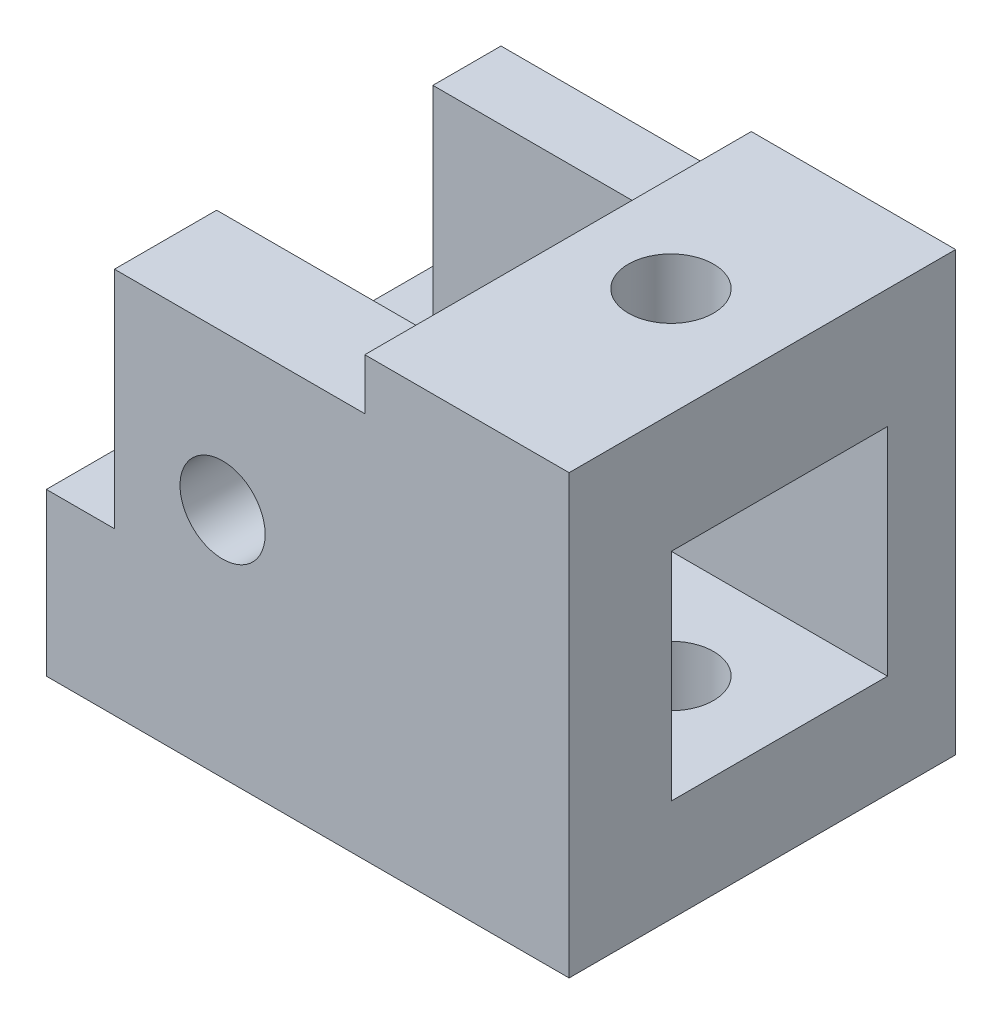
ISO-10303-21;
HEADER;
FILE_DESCRIPTION(('STEP AP214'),'2;1');
FILE_NAME('part.step','',(''),(''),'','','');
FILE_SCHEMA(('AUTOMOTIVE_DESIGN { 1 0 10303 214 1 1 1 1 }'));
ENDSEC;
DATA;
#1=APPLICATION_CONTEXT('core data for automotive mechanical design processes');
#2=APPLICATION_PROTOCOL_DEFINITION('international standard','automotive_design',2000,#1);
#3=PRODUCT_CONTEXT('',#1,'mechanical');
#4=PRODUCT('Part','Part','',(#3));
#5=PRODUCT_RELATED_PRODUCT_CATEGORY('part','',(#4));
#6=PRODUCT_DEFINITION_FORMATION('','',#4);
#7=PRODUCT_DEFINITION_CONTEXT('part definition',#1,'design');
#8=PRODUCT_DEFINITION('design','',#6,#7);
#9=PRODUCT_DEFINITION_SHAPE('','',#8);
#10=(LENGTH_UNIT() NAMED_UNIT(*) SI_UNIT(.MILLI.,.METRE.));
#11=(NAMED_UNIT(*) PLANE_ANGLE_UNIT() SI_UNIT($,.RADIAN.));
#12=(NAMED_UNIT(*) SI_UNIT($,.STERADIAN.) SOLID_ANGLE_UNIT());
#13=UNCERTAINTY_MEASURE_WITH_UNIT(LENGTH_MEASURE(1.E-05),#10,'distance_accuracy_value','');
#14=(GEOMETRIC_REPRESENTATION_CONTEXT(3) GLOBAL_UNCERTAINTY_ASSIGNED_CONTEXT((#13)) GLOBAL_UNIT_ASSIGNED_CONTEXT((#10,
#11,#12)) REPRESENTATION_CONTEXT('',''));
#15=CARTESIAN_POINT('',(0.,0.,0.));
#16=DIRECTION('',(0.,0.,1.));
#17=DIRECTION('',(1.,0.,0.));
#18=AXIS2_PLACEMENT_3D('',#15,#16,#17);
#19=CARTESIAN_POINT('',(0.,-6.,0.));
#20=DIRECTION('',(1.,0.,0.));
#21=DIRECTION('',(0.,0.,-1.));
#22=AXIS2_PLACEMENT_3D('',#19,#20,#21);
#23=PLANE('',#22);
#24=DIRECTION('',(0.,0.,-1.));
#25=VECTOR('',#24,1.);
#26=CARTESIAN_POINT('',(0.,3.5,0.));
#27=LINE('',#26,#25);
#28=CARTESIAN_POINT('',(0.,3.5,0.));
#29=VERTEX_POINT('',#28);
#30=CARTESIAN_POINT('',(0.,3.5,-6.));
#31=VERTEX_POINT('',#30);
#32=EDGE_CURVE('E77',#29,#31,#27,.T.);
#33=ORIENTED_EDGE('',*,*,#32,.F.);
#34=DIRECTION('',(0.,1.,0.));
#35=VECTOR('',#34,1.);
#36=CARTESIAN_POINT('',(0.,-6.,0.));
#37=LINE('',#36,#35);
#38=CARTESIAN_POINT('',(0.,16.7,0.));
#39=VERTEX_POINT('',#38);
#40=EDGE_CURVE('E346',#29,#39,#37,.T.);
#41=ORIENTED_EDGE('',*,*,#40,.T.);
#42=DIRECTION('',(0.,0.,1.));
#43=VECTOR('',#42,1.);
#44=CARTESIAN_POINT('',(0.,16.7,-6.));
#45=LINE('',#44,#43);
#46=CARTESIAN_POINT('',(0.,16.7,-6.));
#47=VERTEX_POINT('',#46);
#48=EDGE_CURVE('E275',#47,#39,#45,.T.);
#49=ORIENTED_EDGE('',*,*,#48,.F.);
#50=DIRECTION('',(0.,-1.,0.));
#51=VECTOR('',#50,1.);
#52=CARTESIAN_POINT('',(0.,12.7,-6.));
#53=LINE('',#52,#51);
#54=EDGE_CURVE('E335',#47,#31,#53,.T.);
#55=ORIENTED_EDGE('',*,*,#54,.T.);
#56=EDGE_LOOP('',(#33,#41,#49,#55));
#57=FACE_BOUND('',#56,.T.);
#58=ADVANCED_FACE('F65',(#57),#23,.F.);
#59=CARTESIAN_POINT('',(0.,3.5,-18.7));
#60=VERTEX_POINT('',#59);
#61=CARTESIAN_POINT('',(0.,3.5,-22.7));
#62=VERTEX_POINT('',#61);
#63=EDGE_CURVE('E12',#60,#62,#27,.T.);
#64=ORIENTED_EDGE('',*,*,#63,.F.);
#65=DIRECTION('',(0.,-1.,0.));
#66=VECTOR('',#65,1.);
#67=CARTESIAN_POINT('',(0.,12.7,-18.7));
#68=LINE('',#67,#66);
#69=CARTESIAN_POINT('',(0.,16.7,-18.7));
#70=VERTEX_POINT('',#69);
#71=EDGE_CURVE('E321',#70,#60,#68,.T.);
#72=ORIENTED_EDGE('',*,*,#71,.F.);
#73=DIRECTION('',(0.,0.,1.));
#74=VECTOR('',#73,1.);
#75=CARTESIAN_POINT('',(0.,16.7,-22.7));
#76=LINE('',#75,#74);
#77=CARTESIAN_POINT('',(0.,16.7,-22.7));
#78=VERTEX_POINT('',#77);
#79=EDGE_CURVE('E260',#78,#70,#76,.T.);
#80=ORIENTED_EDGE('',*,*,#79,.F.);
#81=DIRECTION('',(0.,1.,0.));
#82=VECTOR('',#81,1.);
#83=CARTESIAN_POINT('',(0.,-6.,-22.7));
#84=LINE('',#83,#82);
#85=EDGE_CURVE('E185',#62,#78,#84,.T.);
#86=ORIENTED_EDGE('',*,*,#85,.F.);
#87=EDGE_LOOP('',(#64,#72,#80,#86));
#88=FACE_BOUND('',#87,.T.);
#89=ADVANCED_FACE('F364',(#88),#23,.F.);
#90=CARTESIAN_POINT('',(0.,0.,0.));
#91=DIRECTION('',(0.,1.,0.));
#92=DIRECTION('',(0.,0.,1.));
#93=AXIS2_PLACEMENT_3D('',#90,#91,#92);
#94=PLANE('',#93);
#95=CARTESIAN_POINT('',(20.33,0.,-12.35));
#96=DIRECTION('',(0.,1.,0.));
#97=DIRECTION('',(0.,0.,1.));
#98=AXIS2_PLACEMENT_3D('',#95,#96,#97);
#99=CIRCLE('',#98,2.5);
#100=CARTESIAN_POINT('',(20.33,0.,-9.85));
#101=VERTEX_POINT('',#100);
#102=EDGE_CURVE('E252',#101,#101,#99,.T.);
#103=ORIENTED_EDGE('',*,*,#102,.F.);
#104=EDGE_LOOP('',(#103));
#105=FACE_BOUND('',#104,.T.);
#106=DIRECTION('',(0.,0.,-1.));
#107=VECTOR('',#106,1.);
#108=CARTESIAN_POINT('',(26.7,0.,0.));
#109=LINE('',#108,#107);
#110=CARTESIAN_POINT('',(26.7,0.,-6.));
#111=VERTEX_POINT('',#110);
#112=CARTESIAN_POINT('',(26.7,0.,-18.7));
#113=VERTEX_POINT('',#112);
#114=EDGE_CURVE('E343',#111,#113,#109,.T.);
#115=ORIENTED_EDGE('',*,*,#114,.T.);
#116=DIRECTION('',(1.,0.,0.));
#117=VECTOR('',#116,1.);
#118=CARTESIAN_POINT('',(0.,0.,-18.7));
#119=LINE('',#118,#117);
#120=CARTESIAN_POINT('',(0.,0.,-18.7));
#121=VERTEX_POINT('',#120);
#122=EDGE_CURVE('E312',#121,#113,#119,.T.);
#123=ORIENTED_EDGE('',*,*,#122,.F.);
#124=DIRECTION('',(0.,0.,-1.));
#125=VECTOR('',#124,1.);
#126=CARTESIAN_POINT('',(0.,0.,0.));
#127=LINE('',#126,#125);
#128=CARTESIAN_POINT('',(0.,0.,-6.));
#129=VERTEX_POINT('',#128);
#130=EDGE_CURVE('E347',#129,#121,#127,.T.);
#131=ORIENTED_EDGE('',*,*,#130,.F.);
#132=DIRECTION('',(1.,0.,0.));
#133=VECTOR('',#132,1.);
#134=CARTESIAN_POINT('',(0.,0.,-6.));
#135=LINE('',#134,#133);
#136=EDGE_CURVE('E327',#129,#111,#135,.T.);
#137=ORIENTED_EDGE('',*,*,#136,.T.);
#138=EDGE_LOOP('',(#115,#123,#131,#137));
#139=FACE_BOUND('',#138,.T.);
#140=ADVANCED_FACE('F413',(#105,#139),#94,.T.);
#141=CARTESIAN_POINT('',(0.,-6.,0.));
#142=DIRECTION('',(0.,0.,1.));
#143=DIRECTION('',(1.,0.,0.));
#144=AXIS2_PLACEMENT_3D('',#141,#142,#143);
#145=PLANE('',#144);
#146=CARTESIAN_POINT('',(6.35,7.63,0.));
#147=DIRECTION('',(0.,0.,1.));
#148=DIRECTION('',(1.,0.,0.));
#149=AXIS2_PLACEMENT_3D('',#146,#147,#148);
#150=CIRCLE('',#149,2.5);
#151=CARTESIAN_POINT('',(8.85,7.63,0.));
#152=VERTEX_POINT('',#151);
#153=EDGE_CURVE('E300',#152,#152,#150,.T.);
#154=ORIENTED_EDGE('',*,*,#153,.F.);
#155=EDGE_LOOP('',(#154));
#156=FACE_BOUND('',#155,.T.);
#157=DIRECTION('',(0.,1.,0.));
#158=VECTOR('',#157,1.);
#159=CARTESIAN_POINT('',(26.7,-6.,0.));
#160=LINE('',#159,#158);
#161=CARTESIAN_POINT('',(26.7,-6.,0.));
#162=VERTEX_POINT('',#161);
#163=CARTESIAN_POINT('',(26.7,19.7,0.));
#164=VERTEX_POINT('',#163);
#165=EDGE_CURVE('E75',#162,#164,#160,.T.);
#166=ORIENTED_EDGE('',*,*,#165,.T.);
#167=DIRECTION('',(1.,0.,0.));
#168=VECTOR('',#167,1.);
#169=CARTESIAN_POINT('',(26.7,19.7,0.));
#170=LINE('',#169,#168);
#171=CARTESIAN_POINT('',(14.7,19.7,0.));
#172=VERTEX_POINT('',#171);
#173=EDGE_CURVE('E201',#172,#164,#170,.T.);
#174=ORIENTED_EDGE('',*,*,#173,.F.);
#175=DIRECTION('',(0.,-1.,0.));
#176=VECTOR('',#175,1.);
#177=CARTESIAN_POINT('',(14.7,19.7,0.));
#178=LINE('',#177,#176);
#179=CARTESIAN_POINT('',(14.7,16.7,0.));
#180=VERTEX_POINT('',#179);
#181=EDGE_CURVE('E212',#172,#180,#178,.T.);
#182=ORIENTED_EDGE('',*,*,#181,.T.);
#183=DIRECTION('',(1.,0.,0.));
#184=VECTOR('',#183,1.);
#185=CARTESIAN_POINT('',(0.,16.7,0.));
#186=LINE('',#185,#184);
#187=EDGE_CURVE('E279',#39,#180,#186,.T.);
#188=ORIENTED_EDGE('',*,*,#187,.F.);
#189=ORIENTED_EDGE('',*,*,#40,.F.);
#190=DIRECTION('',(1.,0.,0.));
#191=VECTOR('',#190,1.);
#192=CARTESIAN_POINT('',(-4.,3.5,0.));
#193=LINE('',#192,#191);
#194=CARTESIAN_POINT('',(-4.,3.5,0.));
#195=VERTEX_POINT('',#194);
#196=EDGE_CURVE('E240',#195,#29,#193,.T.);
#197=ORIENTED_EDGE('',*,*,#196,.F.);
#198=DIRECTION('',(0.,1.,0.));
#199=VECTOR('',#198,1.);
#200=CARTESIAN_POINT('',(-4.,-6.,0.));
#201=LINE('',#200,#199);
#202=CARTESIAN_POINT('',(-4.,-6.,0.));
#203=VERTEX_POINT('',#202);
#204=EDGE_CURVE('E219',#203,#195,#201,.T.);
#205=ORIENTED_EDGE('',*,*,#204,.F.);
#206=DIRECTION('',(1.,0.,0.));
#207=VECTOR('',#206,1.);
#208=CARTESIAN_POINT('',(0.,-6.,0.));
#209=LINE('',#208,#207);
#210=EDGE_CURVE('E339',#203,#162,#209,.T.);
#211=ORIENTED_EDGE('',*,*,#210,.T.);
#212=EDGE_LOOP('',(#166,#174,#182,#188,#189,#197,#205,#211));
#213=FACE_BOUND('',#212,.T.);
#214=ADVANCED_FACE('F385',(#156,#213),#145,.T.);
#215=CARTESIAN_POINT('',(26.7,-6.,0.));
#216=DIRECTION('',(1.,0.,0.));
#217=DIRECTION('',(0.,0.,-1.));
#218=AXIS2_PLACEMENT_3D('',#215,#216,#217);
#219=PLANE('',#218);
#220=DIRECTION('',(0.,-1.,0.));
#221=VECTOR('',#220,1.);
#222=CARTESIAN_POINT('',(26.7,12.7,-6.));
#223=LINE('',#222,#221);
#224=CARTESIAN_POINT('',(26.7,12.7,-6.));
#225=VERTEX_POINT('',#224);
#226=EDGE_CURVE('E331',#225,#111,#223,.T.);
#227=ORIENTED_EDGE('',*,*,#226,.F.);
#228=DIRECTION('',(0.,0.,-1.));
#229=VECTOR('',#228,1.);
#230=CARTESIAN_POINT('',(26.7,12.7,0.));
#231=LINE('',#230,#229);
#232=CARTESIAN_POINT('',(26.7,12.7,-18.7));
#233=VERTEX_POINT('',#232);
#234=EDGE_CURVE('E261',#225,#233,#231,.T.);
#235=ORIENTED_EDGE('',*,*,#234,.T.);
#236=DIRECTION('',(0.,-1.,0.));
#237=VECTOR('',#236,1.);
#238=CARTESIAN_POINT('',(26.7,12.7,-18.7));
#239=LINE('',#238,#237);
#240=EDGE_CURVE('E324',#233,#113,#239,.T.);
#241=ORIENTED_EDGE('',*,*,#240,.T.);
#242=ORIENTED_EDGE('',*,*,#114,.F.);
#243=EDGE_LOOP('',(#227,#235,#241,#242));
#244=FACE_BOUND('',#243,.T.);
#245=DIRECTION('',(0.,1.,0.));
#246=VECTOR('',#245,1.);
#247=CARTESIAN_POINT('',(26.7,-6.,-22.7));
#248=LINE('',#247,#246);
#249=CARTESIAN_POINT('',(26.7,-6.,-22.7));
#250=VERTEX_POINT('',#249);
#251=CARTESIAN_POINT('',(26.7,19.7,-22.7));
#252=VERTEX_POINT('',#251);
#253=EDGE_CURVE('E175',#250,#252,#248,.T.);
#254=ORIENTED_EDGE('',*,*,#253,.T.);
#255=DIRECTION('',(0.,0.,-1.));
#256=VECTOR('',#255,1.);
#257=CARTESIAN_POINT('',(26.7,19.7,-22.7));
#258=LINE('',#257,#256);
#259=EDGE_CURVE('E179',#164,#252,#258,.T.);
#260=ORIENTED_EDGE('',*,*,#259,.F.);
#261=ORIENTED_EDGE('',*,*,#165,.F.);
#262=DIRECTION('',(0.,0.,-1.));
#263=VECTOR('',#262,1.);
#264=CARTESIAN_POINT('',(26.7,-6.,0.));
#265=LINE('',#264,#263);
#266=EDGE_CURVE('E181',#162,#250,#265,.T.);
#267=ORIENTED_EDGE('',*,*,#266,.T.);
#268=EDGE_LOOP('',(#254,#260,#261,#267));
#269=FACE_BOUND('',#268,.T.);
#270=ADVANCED_FACE('F177',(#244,#269),#219,.T.);
#271=CARTESIAN_POINT('',(0.,-6.,0.));
#272=DIRECTION('',(0.,1.,0.));
#273=DIRECTION('',(0.,0.,1.));
#274=AXIS2_PLACEMENT_3D('',#271,#272,#273);
#275=PLANE('',#274);
#276=CARTESIAN_POINT('',(20.33,-6.,-12.35));
#277=DIRECTION('',(0.,1.,0.));
#278=DIRECTION('',(0.,0.,1.));
#279=AXIS2_PLACEMENT_3D('',#276,#277,#278);
#280=CIRCLE('',#279,2.5);
#281=CARTESIAN_POINT('',(20.33,-6.,-9.85));
#282=VERTEX_POINT('',#281);
#283=EDGE_CURVE('E244',#282,#282,#280,.T.);
#284=ORIENTED_EDGE('',*,*,#283,.T.);
#285=EDGE_LOOP('',(#284));
#286=FACE_BOUND('',#285,.T.);
#287=ORIENTED_EDGE('',*,*,#210,.F.);
#288=DIRECTION('',(0.,0.,1.));
#289=VECTOR('',#288,1.);
#290=CARTESIAN_POINT('',(-4.,-6.,0.));
#291=LINE('',#290,#289);
#292=CARTESIAN_POINT('',(-4.,-6.,-22.7));
#293=VERTEX_POINT('',#292);
#294=EDGE_CURVE('E230',#293,#203,#291,.T.);
#295=ORIENTED_EDGE('',*,*,#294,.F.);
#296=DIRECTION('',(1.,0.,0.));
#297=VECTOR('',#296,1.);
#298=CARTESIAN_POINT('',(0.,-6.,-22.7));
#299=LINE('',#298,#297);
#300=EDGE_CURVE('E186',#293,#250,#299,.T.);
#301=ORIENTED_EDGE('',*,*,#300,.T.);
#302=ORIENTED_EDGE('',*,*,#266,.F.);
#303=EDGE_LOOP('',(#287,#295,#301,#302));
#304=FACE_BOUND('',#303,.T.);
#305=ADVANCED_FACE('F394',(#286,#304),#275,.F.);
#306=CARTESIAN_POINT('',(0.,-6.,-22.7));
#307=DIRECTION('',(0.,0.,1.));
#308=DIRECTION('',(1.,0.,0.));
#309=AXIS2_PLACEMENT_3D('',#306,#307,#308);
#310=PLANE('',#309);
#311=CARTESIAN_POINT('',(6.35,7.63,-22.7));
#312=DIRECTION('',(0.,0.,1.));
#313=DIRECTION('',(1.,0.,0.));
#314=AXIS2_PLACEMENT_3D('',#311,#312,#313);
#315=CIRCLE('',#314,2.5);
#316=CARTESIAN_POINT('',(8.85,7.63,-22.7));
#317=VERTEX_POINT('',#316);
#318=EDGE_CURVE('E301',#317,#317,#315,.T.);
#319=ORIENTED_EDGE('',*,*,#318,.T.);
#320=EDGE_LOOP('',(#319));
#321=FACE_BOUND('',#320,.T.);
#322=ORIENTED_EDGE('',*,*,#300,.F.);
#323=DIRECTION('',(0.,-1.,0.));
#324=VECTOR('',#323,1.);
#325=CARTESIAN_POINT('',(-4.,-6.,-22.7));
#326=LINE('',#325,#324);
#327=CARTESIAN_POINT('',(-4.,3.5,-22.7));
#328=VERTEX_POINT('',#327);
#329=EDGE_CURVE('E226',#328,#293,#326,.T.);
#330=ORIENTED_EDGE('',*,*,#329,.F.);
#331=DIRECTION('',(1.,0.,0.));
#332=VECTOR('',#331,1.);
#333=CARTESIAN_POINT('',(-4.,3.5,-22.7));
#334=LINE('',#333,#332);
#335=EDGE_CURVE('E233',#328,#62,#334,.T.);
#336=ORIENTED_EDGE('',*,*,#335,.T.);
#337=ORIENTED_EDGE('',*,*,#85,.T.);
#338=DIRECTION('',(-1.,0.,0.));
#339=VECTOR('',#338,1.);
#340=CARTESIAN_POINT('',(26.7,16.7,-22.7));
#341=LINE('',#340,#339);
#342=CARTESIAN_POINT('',(14.7,16.7,-22.7));
#343=VERTEX_POINT('',#342);
#344=EDGE_CURVE('E257',#343,#78,#341,.T.);
#345=ORIENTED_EDGE('',*,*,#344,.F.);
#346=DIRECTION('',(0.,-1.,0.));
#347=VECTOR('',#346,1.);
#348=CARTESIAN_POINT('',(14.7,19.7,-22.7));
#349=LINE('',#348,#347);
#350=CARTESIAN_POINT('',(14.7,19.7,-22.7));
#351=VERTEX_POINT('',#350);
#352=EDGE_CURVE('E191',#351,#343,#349,.T.);
#353=ORIENTED_EDGE('',*,*,#352,.F.);
#354=DIRECTION('',(-1.,0.,0.));
#355=VECTOR('',#354,1.);
#356=CARTESIAN_POINT('',(26.7,19.7,-22.7));
#357=LINE('',#356,#355);
#358=EDGE_CURVE('E189',#252,#351,#357,.T.);
#359=ORIENTED_EDGE('',*,*,#358,.F.);
#360=ORIENTED_EDGE('',*,*,#253,.F.);
#361=EDGE_LOOP('',(#322,#330,#336,#337,#345,#353,#359,#360));
#362=FACE_BOUND('',#361,.T.);
#363=ADVANCED_FACE('F67',(#321,#362),#310,.F.);
#364=CARTESIAN_POINT('',(0.,12.7,-6.));
#365=DIRECTION('',(0.,0.,-1.));
#366=DIRECTION('',(-1.,0.,0.));
#367=AXIS2_PLACEMENT_3D('',#364,#365,#366);
#368=PLANE('',#367);
#369=CARTESIAN_POINT('',(6.35,7.63,-6.));
#370=DIRECTION('',(0.,0.,-1.));
#371=DIRECTION('',(-1.,0.,0.));
#372=AXIS2_PLACEMENT_3D('',#369,#370,#371);
#373=CIRCLE('',#372,2.5);
#374=CARTESIAN_POINT('',(3.85,7.63,-6.));
#375=VERTEX_POINT('',#374);
#376=EDGE_CURVE('E308',#375,#375,#373,.T.);
#377=ORIENTED_EDGE('',*,*,#376,.F.);
#378=EDGE_LOOP('',(#377));
#379=FACE_BOUND('',#378,.T.);
#380=ORIENTED_EDGE('',*,*,#136,.F.);
#381=EDGE_CURVE('E334',#31,#129,#53,.T.);
#382=ORIENTED_EDGE('',*,*,#381,.F.);
#383=ORIENTED_EDGE('',*,*,#54,.F.);
#384=DIRECTION('',(-1.,0.,0.));
#385=VECTOR('',#384,1.);
#386=CARTESIAN_POINT('',(12.7,16.7,-6.));
#387=LINE('',#386,#385);
#388=CARTESIAN_POINT('',(12.7,16.7,-6.));
#389=VERTEX_POINT('',#388);
#390=EDGE_CURVE('E271',#389,#47,#387,.T.);
#391=ORIENTED_EDGE('',*,*,#390,.F.);
#392=DIRECTION('',(0.,-1.,0.));
#393=VECTOR('',#392,1.);
#394=CARTESIAN_POINT('',(12.7,16.7,-6.));
#395=LINE('',#394,#393);
#396=CARTESIAN_POINT('',(12.7,12.7,-6.));
#397=VERTEX_POINT('',#396);
#398=EDGE_CURVE('E282',#389,#397,#395,.T.);
#399=ORIENTED_EDGE('',*,*,#398,.T.);
#400=DIRECTION('',(1.,0.,0.));
#401=VECTOR('',#400,1.);
#402=CARTESIAN_POINT('',(0.,12.7,-6.));
#403=LINE('',#402,#401);
#404=EDGE_CURVE('E296',#397,#225,#403,.T.);
#405=ORIENTED_EDGE('',*,*,#404,.T.);
#406=ORIENTED_EDGE('',*,*,#226,.T.);
#407=EDGE_LOOP('',(#380,#382,#383,#391,#399,#405,#406));
#408=FACE_BOUND('',#407,.T.);
#409=ADVANCED_FACE('F402',(#379,#408),#368,.T.);
#410=CARTESIAN_POINT('',(0.,12.7,-18.7));
#411=DIRECTION('',(0.,0.,-1.));
#412=DIRECTION('',(-1.,0.,0.));
#413=AXIS2_PLACEMENT_3D('',#410,#411,#412);
#414=PLANE('',#413);
#415=CARTESIAN_POINT('',(6.35,7.63,-18.7));
#416=DIRECTION('',(0.,0.,-1.));
#417=DIRECTION('',(-1.,0.,0.));
#418=AXIS2_PLACEMENT_3D('',#415,#416,#417);
#419=CIRCLE('',#418,2.5);
#420=CARTESIAN_POINT('',(3.85,7.63,-18.7));
#421=VERTEX_POINT('',#420);
#422=EDGE_CURVE('E69',#421,#421,#419,.T.);
#423=ORIENTED_EDGE('',*,*,#422,.T.);
#424=EDGE_LOOP('',(#423));
#425=FACE_BOUND('',#424,.T.);
#426=ORIENTED_EDGE('',*,*,#122,.T.);
#427=ORIENTED_EDGE('',*,*,#240,.F.);
#428=DIRECTION('',(1.,0.,0.));
#429=VECTOR('',#428,1.);
#430=CARTESIAN_POINT('',(0.,12.7,-18.7));
#431=LINE('',#430,#429);
#432=CARTESIAN_POINT('',(12.7,12.7,-18.7));
#433=VERTEX_POINT('',#432);
#434=EDGE_CURVE('E313',#433,#233,#431,.T.);
#435=ORIENTED_EDGE('',*,*,#434,.F.);
#436=DIRECTION('',(0.,-1.,0.));
#437=VECTOR('',#436,1.);
#438=CARTESIAN_POINT('',(12.7,16.7,-18.7));
#439=LINE('',#438,#437);
#440=CARTESIAN_POINT('',(12.7,16.7,-18.7));
#441=VERTEX_POINT('',#440);
#442=EDGE_CURVE('E292',#441,#433,#439,.T.);
#443=ORIENTED_EDGE('',*,*,#442,.F.);
#444=DIRECTION('',(1.,0.,0.));
#445=VECTOR('',#444,1.);
#446=CARTESIAN_POINT('',(0.,16.7,-18.7));
#447=LINE('',#446,#445);
#448=EDGE_CURVE('E265',#70,#441,#447,.T.);
#449=ORIENTED_EDGE('',*,*,#448,.F.);
#450=ORIENTED_EDGE('',*,*,#71,.T.);
#451=EDGE_CURVE('E317',#60,#121,#68,.T.);
#452=ORIENTED_EDGE('',*,*,#451,.T.);
#453=EDGE_LOOP('',(#426,#427,#435,#443,#449,#450,#452));
#454=FACE_BOUND('',#453,.T.);
#455=ADVANCED_FACE('F369',(#425,#454),#414,.F.);
#456=CARTESIAN_POINT('',(6.35,7.63,-22.7));
#457=DIRECTION('',(0.,0.,1.));
#458=DIRECTION('',(1.,0.,0.));
#459=AXIS2_PLACEMENT_3D('',#456,#457,#458);
#460=CYLINDRICAL_SURFACE('',#459,2.5);
#461=ORIENTED_EDGE('',*,*,#318,.F.);
#462=EDGE_LOOP('',(#461));
#463=FACE_BOUND('',#462,.T.);
#464=ORIENTED_EDGE('',*,*,#422,.F.);
#465=EDGE_LOOP('',(#464));
#466=FACE_BOUND('',#465,.T.);
#467=ADVANCED_FACE('F446',(#463,#466),#460,.F.);
#468=ORIENTED_EDGE('',*,*,#376,.T.);
#469=EDGE_LOOP('',(#468));
#470=FACE_BOUND('',#469,.T.);
#471=ORIENTED_EDGE('',*,*,#153,.T.);
#472=EDGE_LOOP('',(#471));
#473=FACE_BOUND('',#472,.T.);
#474=ADVANCED_FACE('F438',(#470,#473),#460,.F.);
#475=CARTESIAN_POINT('',(0.,12.7,0.));
#476=DIRECTION('',(0.,1.,0.));
#477=DIRECTION('',(0.,0.,1.));
#478=AXIS2_PLACEMENT_3D('',#475,#476,#477);
#479=PLANE('',#478);
#480=CARTESIAN_POINT('',(20.33,12.7,-12.35));
#481=DIRECTION('',(0.,1.,0.));
#482=DIRECTION('',(0.,0.,1.));
#483=AXIS2_PLACEMENT_3D('',#480,#481,#482);
#484=CIRCLE('',#483,2.5);
#485=CARTESIAN_POINT('',(20.33,12.7,-9.85));
#486=VERTEX_POINT('',#485);
#487=EDGE_CURVE('E248',#486,#486,#484,.T.);
#488=ORIENTED_EDGE('',*,*,#487,.T.);
#489=EDGE_LOOP('',(#488));
#490=FACE_BOUND('',#489,.T.);
#491=ORIENTED_EDGE('',*,*,#404,.F.);
#492=DIRECTION('',(0.,0.,1.));
#493=VECTOR('',#492,1.);
#494=CARTESIAN_POINT('',(12.7,12.7,-18.7));
#495=LINE('',#494,#493);
#496=EDGE_CURVE('E256',#433,#397,#495,.T.);
#497=ORIENTED_EDGE('',*,*,#496,.F.);
#498=ORIENTED_EDGE('',*,*,#434,.T.);
#499=ORIENTED_EDGE('',*,*,#234,.F.);
#500=EDGE_LOOP('',(#491,#497,#498,#499));
#501=FACE_BOUND('',#500,.T.);
#502=ADVANCED_FACE('F436',(#490,#501),#479,.F.);
#503=CARTESIAN_POINT('',(12.7,16.7,-18.7));
#504=DIRECTION('',(1.,0.,0.));
#505=DIRECTION('',(0.,0.,-1.));
#506=AXIS2_PLACEMENT_3D('',#503,#504,#505);
#507=PLANE('',#506);
#508=ORIENTED_EDGE('',*,*,#496,.T.);
#509=ORIENTED_EDGE('',*,*,#398,.F.);
#510=DIRECTION('',(0.,0.,1.));
#511=VECTOR('',#510,1.);
#512=CARTESIAN_POINT('',(12.7,16.7,-18.7));
#513=LINE('',#512,#511);
#514=EDGE_CURVE('E268',#441,#389,#513,.T.);
#515=ORIENTED_EDGE('',*,*,#514,.F.);
#516=ORIENTED_EDGE('',*,*,#442,.T.);
#517=EDGE_LOOP('',(#508,#509,#515,#516));
#518=FACE_BOUND('',#517,.T.);
#519=ADVANCED_FACE('F375',(#518),#507,.F.);
#520=CARTESIAN_POINT('',(0.,16.7,0.));
#521=DIRECTION('',(0.,1.,0.));
#522=DIRECTION('',(0.,0.,1.));
#523=AXIS2_PLACEMENT_3D('',#520,#521,#522);
#524=PLANE('',#523);
#525=DIRECTION('',(0.,0.,1.));
#526=VECTOR('',#525,1.);
#527=CARTESIAN_POINT('',(14.7,16.7,-22.7));
#528=LINE('',#527,#526);
#529=EDGE_CURVE('E85',#343,#180,#528,.T.);
#530=ORIENTED_EDGE('',*,*,#529,.F.);
#531=ORIENTED_EDGE('',*,*,#344,.T.);
#532=ORIENTED_EDGE('',*,*,#79,.T.);
#533=ORIENTED_EDGE('',*,*,#448,.T.);
#534=ORIENTED_EDGE('',*,*,#514,.T.);
#535=ORIENTED_EDGE('',*,*,#390,.T.);
#536=ORIENTED_EDGE('',*,*,#48,.T.);
#537=ORIENTED_EDGE('',*,*,#187,.T.);
#538=EDGE_LOOP('',(#530,#531,#532,#533,#534,#535,#536,#537));
#539=FACE_BOUND('',#538,.T.);
#540=ADVANCED_FACE('F366',(#539),#524,.T.);
#541=CARTESIAN_POINT('',(20.33,-6.,-12.35));
#542=DIRECTION('',(0.,1.,0.));
#543=DIRECTION('',(0.,0.,1.));
#544=AXIS2_PLACEMENT_3D('',#541,#542,#543);
#545=CYLINDRICAL_SURFACE('',#544,2.5);
#546=ORIENTED_EDGE('',*,*,#487,.F.);
#547=EDGE_LOOP('',(#546));
#548=FACE_BOUND('',#547,.T.);
#549=CARTESIAN_POINT('',(20.33,19.7,-12.35));
#550=DIRECTION('',(0.,1.,0.));
#551=DIRECTION('',(0.,0.,1.));
#552=AXIS2_PLACEMENT_3D('',#549,#550,#551);
#553=CIRCLE('',#552,2.5);
#554=CARTESIAN_POINT('',(20.33,19.7,-9.85));
#555=VERTEX_POINT('',#554);
#556=EDGE_CURVE('E205',#555,#555,#553,.T.);
#557=ORIENTED_EDGE('',*,*,#556,.T.);
#558=EDGE_LOOP('',(#557));
#559=FACE_BOUND('',#558,.T.);
#560=ADVANCED_FACE('F524',(#548,#559),#545,.F.);
#561=ORIENTED_EDGE('',*,*,#102,.T.);
#562=EDGE_LOOP('',(#561));
#563=FACE_BOUND('',#562,.T.);
#564=ORIENTED_EDGE('',*,*,#283,.F.);
#565=EDGE_LOOP('',(#564));
#566=FACE_BOUND('',#565,.T.);
#567=ADVANCED_FACE('F475',(#563,#566),#545,.F.);
#568=CARTESIAN_POINT('',(0.,0.,0.));
#569=DIRECTION('',(-1.,0.,0.));
#570=DIRECTION('',(0.,0.,1.));
#571=AXIS2_PLACEMENT_3D('',#568,#569,#570);
#572=PLANE('',#571);
#573=EDGE_CURVE('E78',#31,#60,#27,.T.);
#574=ORIENTED_EDGE('',*,*,#573,.F.);
#575=ORIENTED_EDGE('',*,*,#381,.T.);
#576=ORIENTED_EDGE('',*,*,#130,.T.);
#577=ORIENTED_EDGE('',*,*,#451,.F.);
#578=EDGE_LOOP('',(#574,#575,#576,#577));
#579=FACE_BOUND('',#578,.T.);
#580=ADVANCED_FACE('F433',(#579),#572,.F.);
#581=CARTESIAN_POINT('',(-4.,3.5,0.));
#582=DIRECTION('',(0.,-1.,0.));
#583=DIRECTION('',(0.,0.,-1.));
#584=AXIS2_PLACEMENT_3D('',#581,#582,#583);
#585=PLANE('',#584);
#586=ORIENTED_EDGE('',*,*,#32,.T.);
#587=ORIENTED_EDGE('',*,*,#573,.T.);
#588=ORIENTED_EDGE('',*,*,#63,.T.);
#589=ORIENTED_EDGE('',*,*,#335,.F.);
#590=DIRECTION('',(0.,0.,-1.));
#591=VECTOR('',#590,1.);
#592=CARTESIAN_POINT('',(-4.,3.5,0.));
#593=LINE('',#592,#591);
#594=EDGE_CURVE('E223',#195,#328,#593,.T.);
#595=ORIENTED_EDGE('',*,*,#594,.F.);
#596=ORIENTED_EDGE('',*,*,#196,.T.);
#597=EDGE_LOOP('',(#586,#587,#588,#589,#595,#596));
#598=FACE_BOUND('',#597,.T.);
#599=ADVANCED_FACE('F388',(#598),#585,.F.);
#600=CARTESIAN_POINT('',(-4.,0.,0.));
#601=DIRECTION('',(-1.,0.,0.));
#602=DIRECTION('',(0.,0.,1.));
#603=AXIS2_PLACEMENT_3D('',#600,#601,#602);
#604=PLANE('',#603);
#605=ORIENTED_EDGE('',*,*,#204,.T.);
#606=ORIENTED_EDGE('',*,*,#594,.T.);
#607=ORIENTED_EDGE('',*,*,#329,.T.);
#608=ORIENTED_EDGE('',*,*,#294,.T.);
#609=EDGE_LOOP('',(#605,#606,#607,#608));
#610=FACE_BOUND('',#609,.T.);
#611=ADVANCED_FACE('F391',(#610),#604,.T.);
#612=CARTESIAN_POINT('',(0.,19.7,0.));
#613=DIRECTION('',(0.,-1.,0.));
#614=DIRECTION('',(0.,0.,-1.));
#615=AXIS2_PLACEMENT_3D('',#612,#613,#614);
#616=PLANE('',#615);
#617=ORIENTED_EDGE('',*,*,#259,.T.);
#618=ORIENTED_EDGE('',*,*,#358,.T.);
#619=DIRECTION('',(0.,0.,1.));
#620=VECTOR('',#619,1.);
#621=CARTESIAN_POINT('',(14.7,19.7,-22.7));
#622=LINE('',#621,#620);
#623=EDGE_CURVE('E195',#351,#172,#622,.T.);
#624=ORIENTED_EDGE('',*,*,#623,.T.);
#625=ORIENTED_EDGE('',*,*,#173,.T.);
#626=EDGE_LOOP('',(#617,#618,#624,#625));
#627=FACE_BOUND('',#626,.T.);
#628=ORIENTED_EDGE('',*,*,#556,.F.);
#629=EDGE_LOOP('',(#628));
#630=FACE_BOUND('',#629,.T.);
#631=ADVANCED_FACE('F198',(#627,#630),#616,.F.);
#632=CARTESIAN_POINT('',(14.7,19.7,-22.7));
#633=DIRECTION('',(1.,0.,0.));
#634=DIRECTION('',(0.,0.,-1.));
#635=AXIS2_PLACEMENT_3D('',#632,#633,#634);
#636=PLANE('',#635);
#637=ORIENTED_EDGE('',*,*,#529,.T.);
#638=ORIENTED_EDGE('',*,*,#181,.F.);
#639=ORIENTED_EDGE('',*,*,#623,.F.);
#640=ORIENTED_EDGE('',*,*,#352,.T.);
#641=EDGE_LOOP('',(#637,#638,#639,#640));
#642=FACE_BOUND('',#641,.T.);
#643=ADVANCED_FACE('F538',(#642),#636,.F.);
#644=CLOSED_SHELL('',(#58,#89,#140,#214,#270,#305,#363,#409,#455,#467,#474,#502,#519,#540,#560,
#567,#580,#599,#611,#631,#643));
#645=MANIFOLD_SOLID_BREP('B2',#644);
#646=ADVANCED_BREP_SHAPE_REPRESENTATION('',(#18,#645),#14);
#647=SHAPE_DEFINITION_REPRESENTATION(#9,#646);
ENDSEC;
END-ISO-10303-21;
